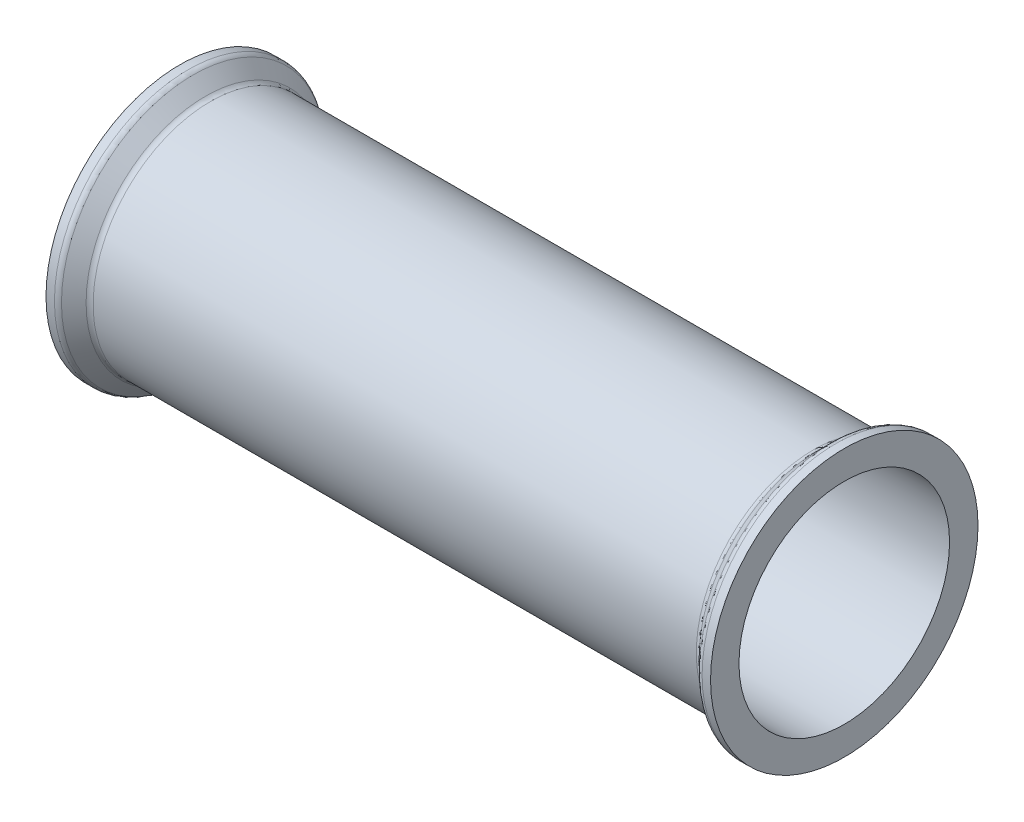
ISO-10303-21;
HEADER;
FILE_DESCRIPTION(('STEP AP214'),'2;1');
FILE_NAME('part.step','',(''),(''),'','','');
FILE_SCHEMA(('AUTOMOTIVE_DESIGN { 1 0 10303 214 1 1 1 1 }'));
ENDSEC;
DATA;
#1=APPLICATION_CONTEXT('core data for automotive mechanical design processes');
#2=APPLICATION_PROTOCOL_DEFINITION('international standard','automotive_design',2000,#1);
#3=PRODUCT_CONTEXT('',#1,'mechanical');
#4=PRODUCT('Part','Part','',(#3));
#5=PRODUCT_RELATED_PRODUCT_CATEGORY('part','',(#4));
#6=PRODUCT_DEFINITION_FORMATION('','',#4);
#7=PRODUCT_DEFINITION_CONTEXT('part definition',#1,'design');
#8=PRODUCT_DEFINITION('design','',#6,#7);
#9=PRODUCT_DEFINITION_SHAPE('','',#8);
#10=(LENGTH_UNIT() NAMED_UNIT(*) SI_UNIT(.MILLI.,.METRE.));
#11=(NAMED_UNIT(*) PLANE_ANGLE_UNIT() SI_UNIT($,.RADIAN.));
#12=(NAMED_UNIT(*) SI_UNIT($,.STERADIAN.) SOLID_ANGLE_UNIT());
#13=UNCERTAINTY_MEASURE_WITH_UNIT(LENGTH_MEASURE(1.E-05),#10,'distance_accuracy_value','');
#14=(GEOMETRIC_REPRESENTATION_CONTEXT(3) GLOBAL_UNCERTAINTY_ASSIGNED_CONTEXT((#13)) GLOBAL_UNIT_ASSIGNED_CONTEXT((#10,
#11,#12)) REPRESENTATION_CONTEXT('',''));
#15=CARTESIAN_POINT('',(0.,0.,0.));
#16=DIRECTION('',(0.,0.,1.));
#17=DIRECTION('',(1.,0.,0.));
#18=AXIS2_PLACEMENT_3D('',#15,#16,#17);
#19=CARTESIAN_POINT('',(-142.,-57.,0.));
#20=DIRECTION('',(1.,0.,0.));
#21=DIRECTION('',(0.,0.,-1.));
#22=AXIS2_PLACEMENT_3D('',#19,#20,#21);
#23=PLANE('',#22);
#24=CARTESIAN_POINT('',(-142.,0.,0.));
#25=DIRECTION('',(1.,0.,0.));
#26=DIRECTION('',(0.,0.,-1.));
#27=AXIS2_PLACEMENT_3D('',#24,#25,#26);
#28=CIRCLE('',#27,45.);
#29=CARTESIAN_POINT('',(-142.,0.,-45.0000000000001));
#30=VERTEX_POINT('',#29);
#31=EDGE_CURVE('E123',#30,#30,#28,.T.);
#32=ORIENTED_EDGE('',*,*,#31,.T.);
#33=EDGE_LOOP('',(#32));
#34=FACE_BOUND('',#33,.T.);
#35=CARTESIAN_POINT('',(-142.,0.,0.));
#36=DIRECTION('',(1.,0.,0.));
#37=DIRECTION('',(0.,0.,-1.));
#38=AXIS2_PLACEMENT_3D('',#35,#36,#37);
#39=CIRCLE('',#38,57.15);
#40=CARTESIAN_POINT('',(-142.,0.,-57.15));
#41=VERTEX_POINT('',#40);
#42=EDGE_CURVE('E39',#41,#41,#39,.T.);
#43=ORIENTED_EDGE('',*,*,#42,.F.);
#44=EDGE_LOOP('',(#43));
#45=FACE_BOUND('',#44,.T.);
#46=ADVANCED_FACE('F36',(#34,#45),#23,.F.);
#47=CARTESIAN_POINT('',(142.,-57.,0.));
#48=DIRECTION('',(-1.,0.,0.));
#49=DIRECTION('',(0.,0.,1.));
#50=AXIS2_PLACEMENT_3D('',#47,#48,#49);
#51=PLANE('',#50);
#52=CARTESIAN_POINT('',(142.,0.,0.));
#53=DIRECTION('',(1.,0.,0.));
#54=DIRECTION('',(0.,0.,-1.));
#55=AXIS2_PLACEMENT_3D('',#52,#53,#54);
#56=CIRCLE('',#55,45.);
#57=CARTESIAN_POINT('',(142.,0.,-45.0000000000001));
#58=VERTEX_POINT('',#57);
#59=EDGE_CURVE('E52',#58,#58,#56,.T.);
#60=ORIENTED_EDGE('',*,*,#59,.F.);
#61=EDGE_LOOP('',(#60));
#62=FACE_BOUND('',#61,.T.);
#63=CARTESIAN_POINT('',(142.,0.,0.));
#64=DIRECTION('',(1.,0.,0.));
#65=DIRECTION('',(0.,0.,-1.));
#66=AXIS2_PLACEMENT_3D('',#63,#64,#65);
#67=CIRCLE('',#66,57.15);
#68=CARTESIAN_POINT('',(142.,0.,-57.1500000000001));
#69=VERTEX_POINT('',#68);
#70=EDGE_CURVE('E117',#69,#69,#67,.F.);
#71=ORIENTED_EDGE('',*,*,#70,.F.);
#72=EDGE_LOOP('',(#71));
#73=FACE_BOUND('',#72,.T.);
#74=ADVANCED_FACE('F134',(#62,#73),#51,.F.);
#75=CARTESIAN_POINT('',(0.,0.,0.));
#76=DIRECTION('',(1.,0.,0.));
#77=DIRECTION('',(0.,0.,-1.));
#78=AXIS2_PLACEMENT_3D('',#75,#76,#77);
#79=CYLINDRICAL_SURFACE('',#78,57.15);
#80=CARTESIAN_POINT('',(-138.392640687119,0.,0.));
#81=DIRECTION('',(-1.,0.,0.));
#82=DIRECTION('',(0.,0.,1.));
#83=AXIS2_PLACEMENT_3D('',#80,#81,#82);
#84=CIRCLE('',#83,57.15);
#85=CARTESIAN_POINT('',(-138.392640687119,0.,57.1500000000001));
#86=VERTEX_POINT('',#85);
#87=EDGE_CURVE('E114',#86,#86,#84,.F.);
#88=ORIENTED_EDGE('',*,*,#87,.F.);
#89=EDGE_LOOP('',(#88));
#90=FACE_BOUND('',#89,.T.);
#91=ORIENTED_EDGE('',*,*,#42,.T.);
#92=EDGE_LOOP('',(#91));
#93=FACE_BOUND('',#92,.T.);
#94=ADVANCED_FACE('F137',(#90,#93),#79,.T.);
#95=CARTESIAN_POINT('',(0.,0.,0.));
#96=DIRECTION('',(1.,0.,0.));
#97=DIRECTION('',(0.,0.,-1.));
#98=AXIS2_PLACEMENT_3D('',#95,#96,#97);
#99=CYLINDRICAL_SURFACE('',#98,57.15);
#100=ORIENTED_EDGE('',*,*,#70,.T.);
#101=EDGE_LOOP('',(#100));
#102=FACE_BOUND('',#101,.T.);
#103=CARTESIAN_POINT('',(138.392640687119,0.,0.));
#104=DIRECTION('',(1.,0.,0.));
#105=DIRECTION('',(0.,0.,-1.));
#106=AXIS2_PLACEMENT_3D('',#103,#104,#105);
#107=CIRCLE('',#106,57.15);
#108=CARTESIAN_POINT('',(138.392640687119,0.,-57.1499999999999));
#109=VERTEX_POINT('',#108);
#110=EDGE_CURVE('E92',#109,#109,#107,.F.);
#111=ORIENTED_EDGE('',*,*,#110,.F.);
#112=EDGE_LOOP('',(#111));
#113=FACE_BOUND('',#112,.T.);
#114=ADVANCED_FACE('F108',(#102,#113),#99,.T.);
#115=CARTESIAN_POINT('',(-138.392640687119,0.,0.));
#116=DIRECTION('',(-1.,0.,0.));
#117=DIRECTION('',(0.,0.,1.));
#118=AXIS2_PLACEMENT_3D('',#115,#116,#117);
#119=TOROIDAL_SURFACE('',#118,54.15,3.);
#120=ORIENTED_EDGE('',*,*,#87,.T.);
#121=EDGE_LOOP('',(#120));
#122=FACE_BOUND('',#121,.T.);
#123=CARTESIAN_POINT('',(-136.271320343569,0.,0.));
#124=DIRECTION('',(-1.,0.,0.));
#125=DIRECTION('',(0.,0.,1.));
#126=AXIS2_PLACEMENT_3D('',#123,#124,#125);
#127=CIRCLE('',#126,56.2713203435503);
#128=CARTESIAN_POINT('',(-136.271320343569,0.,56.2713203435503));
#129=VERTEX_POINT('',#128);
#130=EDGE_CURVE('E87',#129,#129,#127,.F.);
#131=ORIENTED_EDGE('',*,*,#130,.F.);
#132=EDGE_LOOP('',(#131));
#133=FACE_BOUND('',#132,.T.);
#134=ADVANCED_FACE('F103',(#122,#133),#119,.T.);
#135=CARTESIAN_POINT('',(138.392640687119,0.,0.));
#136=DIRECTION('',(1.,0.,0.));
#137=DIRECTION('',(0.,0.,-1.));
#138=AXIS2_PLACEMENT_3D('',#135,#136,#137);
#139=TOROIDAL_SURFACE('',#138,54.1500000000001,3.);
#140=ORIENTED_EDGE('',*,*,#110,.T.);
#141=EDGE_LOOP('',(#140));
#142=FACE_BOUND('',#141,.T.);
#143=CARTESIAN_POINT('',(136.271320343544,0.,0.));
#144=DIRECTION('',(1.,0.,0.));
#145=DIRECTION('',(0.,0.,-1.));
#146=AXIS2_PLACEMENT_3D('',#143,#144,#145);
#147=CIRCLE('',#146,56.2713203435755);
#148=CARTESIAN_POINT('',(136.271320343544,0.,-56.2713203435755));
#149=VERTEX_POINT('',#148);
#150=EDGE_CURVE('E82',#149,#149,#147,.F.);
#151=ORIENTED_EDGE('',*,*,#150,.F.);
#152=EDGE_LOOP('',(#151));
#153=FACE_BOUND('',#152,.T.);
#154=ADVANCED_FACE('F99',(#142,#153),#139,.T.);
#155=CARTESIAN_POINT('',(-136.271320343569,0.,0.));
#156=DIRECTION('',(-1.,0.,0.));
#157=DIRECTION('',(0.,0.,1.));
#158=AXIS2_PLACEMENT_3D('',#155,#156,#157);
#159=CONICAL_SURFACE('',#158,56.2713203435503,0.785398163400002);
#160=ORIENTED_EDGE('',*,*,#130,.T.);
#161=EDGE_LOOP('',(#160));
#162=FACE_BOUND('',#161,.T.);
#163=CARTESIAN_POINT('',(-131.00867965644,0.,0.));
#164=DIRECTION('',(1.,0.,0.));
#165=DIRECTION('',(0.,0.,-1.));
#166=AXIS2_PLACEMENT_3D('',#163,#164,#165);
#167=CIRCLE('',#166,51.0086796564401);
#168=CARTESIAN_POINT('',(-131.00867965644,0.,-51.0086796564401));
#169=VERTEX_POINT('',#168);
#170=EDGE_CURVE('E79',#169,#169,#167,.F.);
#171=ORIENTED_EDGE('',*,*,#170,.T.);
#172=EDGE_LOOP('',(#171));
#173=FACE_BOUND('',#172,.T.);
#174=ADVANCED_FACE('F102',(#162,#173),#159,.T.);
#175=CARTESIAN_POINT('',(136.271320343544,0.,0.));
#176=DIRECTION('',(1.,0.,0.));
#177=DIRECTION('',(0.,0.,-1.));
#178=AXIS2_PLACEMENT_3D('',#175,#176,#177);
#179=CONICAL_SURFACE('',#178,56.2713203435755,0.785398163400002);
#180=ORIENTED_EDGE('',*,*,#150,.T.);
#181=EDGE_LOOP('',(#180));
#182=FACE_BOUND('',#181,.T.);
#183=CARTESIAN_POINT('',(131.00867965644,0.,0.));
#184=DIRECTION('',(1.,0.,0.));
#185=DIRECTION('',(0.,0.,-1.));
#186=AXIS2_PLACEMENT_3D('',#183,#184,#185);
#187=CIRCLE('',#186,51.0086796564401);
#188=CARTESIAN_POINT('',(131.00867965644,0.,-51.00867965644));
#189=VERTEX_POINT('',#188);
#190=EDGE_CURVE('E48',#189,#189,#187,.T.);
#191=ORIENTED_EDGE('',*,*,#190,.T.);
#192=EDGE_LOOP('',(#191));
#193=FACE_BOUND('',#192,.T.);
#194=ADVANCED_FACE('F73',(#182,#193),#179,.T.);
#195=CARTESIAN_POINT('',(-128.887359312881,0.,0.));
#196=DIRECTION('',(1.,0.,0.));
#197=DIRECTION('',(0.,0.,-1.));
#198=AXIS2_PLACEMENT_3D('',#195,#196,#197);
#199=TOROIDAL_SURFACE('',#198,53.13,3.);
#200=ORIENTED_EDGE('',*,*,#170,.F.);
#201=EDGE_LOOP('',(#200));
#202=FACE_BOUND('',#201,.T.);
#203=CARTESIAN_POINT('',(-128.887359312881,0.,0.));
#204=DIRECTION('',(1.,0.,0.));
#205=DIRECTION('',(0.,0.,-1.));
#206=AXIS2_PLACEMENT_3D('',#203,#204,#205);
#207=CIRCLE('',#206,50.13);
#208=CARTESIAN_POINT('',(-128.887359312881,0.,-50.13));
#209=VERTEX_POINT('',#208);
#210=EDGE_CURVE('E43',#209,#209,#207,.T.);
#211=ORIENTED_EDGE('',*,*,#210,.F.);
#212=EDGE_LOOP('',(#211));
#213=FACE_BOUND('',#212,.T.);
#214=ADVANCED_FACE('F67',(#202,#213),#199,.F.);
#215=CARTESIAN_POINT('',(128.887359312881,0.,0.));
#216=DIRECTION('',(1.,0.,0.));
#217=DIRECTION('',(0.,0.,-1.));
#218=AXIS2_PLACEMENT_3D('',#215,#216,#217);
#219=TOROIDAL_SURFACE('',#218,53.13,3.);
#220=CARTESIAN_POINT('',(128.887359312881,0.,0.));
#221=DIRECTION('',(1.,0.,0.));
#222=DIRECTION('',(0.,0.,-1.));
#223=AXIS2_PLACEMENT_3D('',#220,#221,#222);
#224=CIRCLE('',#223,50.13);
#225=CARTESIAN_POINT('',(128.887359312881,0.,-50.13));
#226=VERTEX_POINT('',#225);
#227=EDGE_CURVE('E10',#226,#226,#224,.F.);
#228=ORIENTED_EDGE('',*,*,#227,.F.);
#229=EDGE_LOOP('',(#228));
#230=FACE_BOUND('',#229,.T.);
#231=ORIENTED_EDGE('',*,*,#190,.F.);
#232=EDGE_LOOP('',(#231));
#233=FACE_BOUND('',#232,.T.);
#234=ADVANCED_FACE('F62',(#230,#233),#219,.F.);
#235=CARTESIAN_POINT('',(0.,0.,0.));
#236=DIRECTION('',(1.,0.,0.));
#237=DIRECTION('',(0.,0.,-1.));
#238=AXIS2_PLACEMENT_3D('',#235,#236,#237);
#239=CYLINDRICAL_SURFACE('',#238,50.13);
#240=ORIENTED_EDGE('',*,*,#227,.T.);
#241=EDGE_LOOP('',(#240));
#242=FACE_BOUND('',#241,.T.);
#243=ORIENTED_EDGE('',*,*,#210,.T.);
#244=EDGE_LOOP('',(#243));
#245=FACE_BOUND('',#244,.T.);
#246=ADVANCED_FACE('F66',(#242,#245),#239,.T.);
#247=CARTESIAN_POINT('',(-142.,0.,0.));
#248=DIRECTION('',(1.,0.,0.));
#249=DIRECTION('',(0.,0.,-1.));
#250=AXIS2_PLACEMENT_3D('',#247,#248,#249);
#251=CYLINDRICAL_SURFACE('',#250,45.);
#252=ORIENTED_EDGE('',*,*,#31,.F.);
#253=EDGE_LOOP('',(#252));
#254=FACE_BOUND('',#253,.T.);
#255=ORIENTED_EDGE('',*,*,#59,.T.);
#256=EDGE_LOOP('',(#255));
#257=FACE_BOUND('',#256,.T.);
#258=ADVANCED_FACE('F132',(#254,#257),#251,.F.);
#259=CLOSED_SHELL('',(#46,#74,#94,#114,#134,#154,#174,#194,#214,#234,#246,#258));
#260=MANIFOLD_SOLID_BREP('B2',#259);
#261=ADVANCED_BREP_SHAPE_REPRESENTATION('',(#18,#260),#14);
#262=SHAPE_DEFINITION_REPRESENTATION(#9,#261);
ENDSEC;
END-ISO-10303-21;
